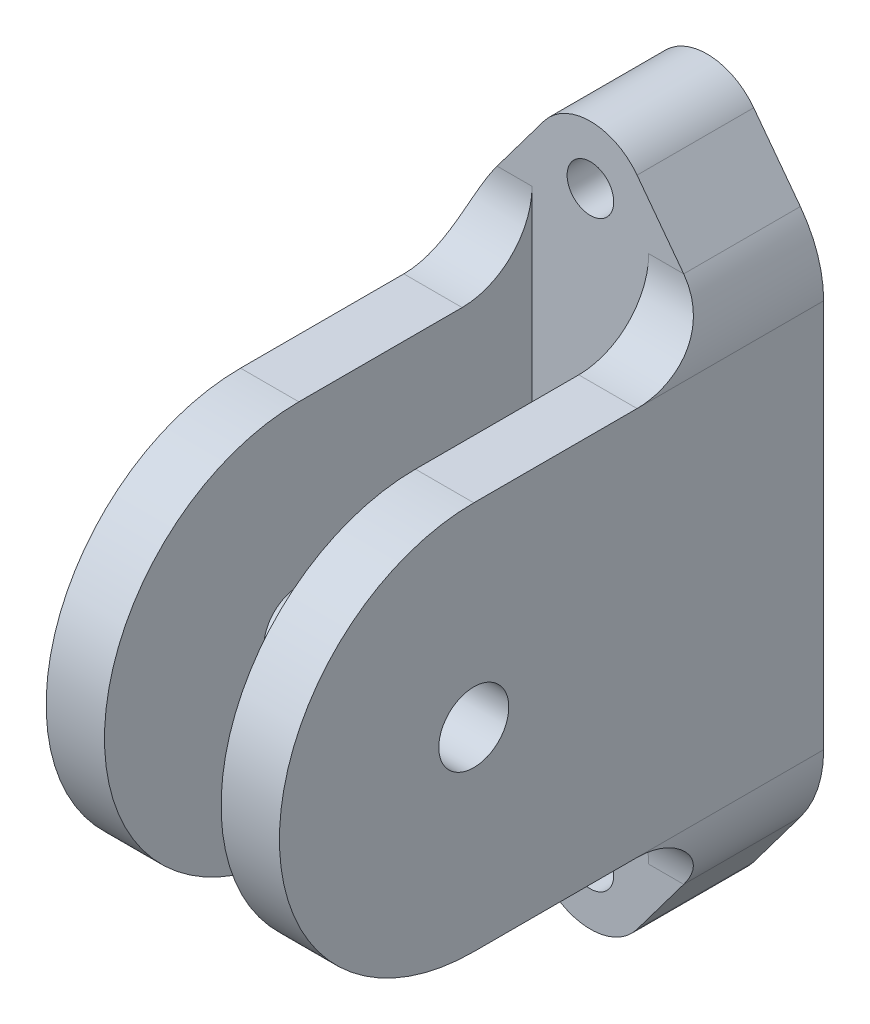
ISO-10303-21;
HEADER;
FILE_DESCRIPTION(('STEP AP214'),'2;1');
FILE_NAME('part.step','',(''),(''),'','','');
FILE_SCHEMA(('AUTOMOTIVE_DESIGN { 1 0 10303 214 1 1 1 1 }'));
ENDSEC;
DATA;
#1=APPLICATION_CONTEXT('core data for automotive mechanical design processes');
#2=APPLICATION_PROTOCOL_DEFINITION('international standard','automotive_design',2000,#1);
#3=PRODUCT_CONTEXT('',#1,'mechanical');
#4=PRODUCT('Part','Part','',(#3));
#5=PRODUCT_RELATED_PRODUCT_CATEGORY('part','',(#4));
#6=PRODUCT_DEFINITION_FORMATION('','',#4);
#7=PRODUCT_DEFINITION_CONTEXT('part definition',#1,'design');
#8=PRODUCT_DEFINITION('design','',#6,#7);
#9=PRODUCT_DEFINITION_SHAPE('','',#8);
#10=(LENGTH_UNIT() NAMED_UNIT(*) SI_UNIT(.MILLI.,.METRE.));
#11=(NAMED_UNIT(*) PLANE_ANGLE_UNIT() SI_UNIT($,.RADIAN.));
#12=(NAMED_UNIT(*) SI_UNIT($,.STERADIAN.) SOLID_ANGLE_UNIT());
#13=UNCERTAINTY_MEASURE_WITH_UNIT(LENGTH_MEASURE(1.E-05),#10,'distance_accuracy_value','');
#14=(GEOMETRIC_REPRESENTATION_CONTEXT(3) GLOBAL_UNCERTAINTY_ASSIGNED_CONTEXT((#13)) GLOBAL_UNIT_ASSIGNED_CONTEXT((#10,
#11,#12)) REPRESENTATION_CONTEXT('',''));
#15=CARTESIAN_POINT('',(0.,0.,0.));
#16=DIRECTION('',(0.,0.,1.));
#17=DIRECTION('',(1.,0.,0.));
#18=AXIS2_PLACEMENT_3D('',#15,#16,#17);
#19=CARTESIAN_POINT('',(0.,12.5,5.));
#20=DIRECTION('',(0.,0.,1.));
#21=DIRECTION('',(1.,0.,0.));
#22=AXIS2_PLACEMENT_3D('',#19,#20,#21);
#23=PLANE('',#22);
#24=CARTESIAN_POINT('',(0.,12.5,5.));
#25=DIRECTION('',(0.,0.,1.));
#26=DIRECTION('',(1.,0.,0.));
#27=AXIS2_PLACEMENT_3D('',#24,#25,#26);
#28=CIRCLE('',#27,1.);
#29=CARTESIAN_POINT('',(1.,12.5,5.));
#30=VERTEX_POINT('',#29);
#31=EDGE_CURVE('E256',#30,#30,#28,.T.);
#32=ORIENTED_EDGE('',*,*,#31,.F.);
#33=EDGE_LOOP('',(#32));
#34=FACE_BOUND('',#33,.T.);
#35=CARTESIAN_POINT('',(0.,-12.5,5.));
#36=DIRECTION('',(0.,0.,1.));
#37=DIRECTION('',(1.,0.,0.));
#38=AXIS2_PLACEMENT_3D('',#35,#36,#37);
#39=CIRCLE('',#38,1.);
#40=CARTESIAN_POINT('',(1.,-12.5,5.));
#41=VERTEX_POINT('',#40);
#42=EDGE_CURVE('E250',#41,#41,#39,.T.);
#43=ORIENTED_EDGE('',*,*,#42,.F.);
#44=EDGE_LOOP('',(#43));
#45=FACE_BOUND('',#44,.T.);
#46=DIRECTION('',(0.,-1.,0.));
#47=VECTOR('',#46,1.);
#48=CARTESIAN_POINT('',(2.5,8.33333333333333,5.));
#49=LINE('',#48,#47);
#50=CARTESIAN_POINT('',(2.5,11.3333333333333,5.));
#51=VERTEX_POINT('',#50);
#52=CARTESIAN_POINT('',(2.5,-11.3333333333333,5.));
#53=VERTEX_POINT('',#52);
#54=EDGE_CURVE('E207',#51,#53,#49,.T.);
#55=ORIENTED_EDGE('',*,*,#54,.F.);
#56=DIRECTION('',(1.,0.,0.));
#57=VECTOR('',#56,1.);
#58=CARTESIAN_POINT('',(0.,11.3333333333333,5.));
#59=LINE('',#58,#57);
#60=CARTESIAN_POINT('',(4.,11.3333333333333,5.));
#61=VERTEX_POINT('',#60);
#62=EDGE_CURVE('E340',#51,#61,#59,.T.);
#63=ORIENTED_EDGE('',*,*,#62,.T.);
#64=DIRECTION('',(-0.6,0.8,0.));
#65=VECTOR('',#64,1.);
#66=CARTESIAN_POINT('',(4.00000000000001,11.3333333333333,5.));
#67=LINE('',#66,#65);
#68=CARTESIAN_POINT('',(2.,14.,5.));
#69=VERTEX_POINT('',#68);
#70=EDGE_CURVE('E276',#61,#69,#67,.T.);
#71=ORIENTED_EDGE('',*,*,#70,.T.);
#72=CARTESIAN_POINT('',(0.,12.5,5.));
#73=DIRECTION('',(0.,0.,1.));
#74=DIRECTION('',(1.,0.,0.));
#75=AXIS2_PLACEMENT_3D('',#72,#73,#74);
#76=CIRCLE('',#75,2.5);
#77=CARTESIAN_POINT('',(-2.,14.,5.));
#78=VERTEX_POINT('',#77);
#79=EDGE_CURVE('E262',#69,#78,#76,.T.);
#80=ORIENTED_EDGE('',*,*,#79,.T.);
#81=DIRECTION('',(-0.6,-0.8,0.));
#82=VECTOR('',#81,1.);
#83=CARTESIAN_POINT('',(-4.00000000000001,11.3333333333333,5.));
#84=LINE('',#83,#82);
#85=CARTESIAN_POINT('',(-4.00000000000001,11.3333333333333,5.));
#86=VERTEX_POINT('',#85);
#87=EDGE_CURVE('E265',#78,#86,#84,.T.);
#88=ORIENTED_EDGE('',*,*,#87,.T.);
#89=DIRECTION('',(-1.,0.,0.));
#90=VECTOR('',#89,1.);
#91=CARTESIAN_POINT('',(-2.5,11.3333333333333,5.));
#92=LINE('',#91,#90);
#93=CARTESIAN_POINT('',(-2.5,11.3333333333333,5.));
#94=VERTEX_POINT('',#93);
#95=EDGE_CURVE('E334',#86,#94,#92,.F.);
#96=ORIENTED_EDGE('',*,*,#95,.T.);
#97=DIRECTION('',(0.,-1.,0.));
#98=VECTOR('',#97,1.);
#99=CARTESIAN_POINT('',(-2.5,8.33333333333333,5.));
#100=LINE('',#99,#98);
#101=CARTESIAN_POINT('',(-2.5,-11.3333333333333,5.));
#102=VERTEX_POINT('',#101);
#103=EDGE_CURVE('E227',#94,#102,#100,.T.);
#104=ORIENTED_EDGE('',*,*,#103,.T.);
#105=DIRECTION('',(-1.,0.,0.));
#106=VECTOR('',#105,1.);
#107=CARTESIAN_POINT('',(-5.,-11.3333333333333,5.));
#108=LINE('',#107,#106);
#109=CARTESIAN_POINT('',(-4.,-11.3333333333333,5.));
#110=VERTEX_POINT('',#109);
#111=EDGE_CURVE('E331',#102,#110,#108,.T.);
#112=ORIENTED_EDGE('',*,*,#111,.T.);
#113=DIRECTION('',(0.6,-0.8,0.));
#114=VECTOR('',#113,1.);
#115=CARTESIAN_POINT('',(-4.00000000000001,-11.3333333333333,5.));
#116=LINE('',#115,#114);
#117=CARTESIAN_POINT('',(-2.,-14.,5.));
#118=VERTEX_POINT('',#117);
#119=EDGE_CURVE('E269',#110,#118,#116,.T.);
#120=ORIENTED_EDGE('',*,*,#119,.T.);
#121=CARTESIAN_POINT('',(0.,-12.5,5.));
#122=DIRECTION('',(0.,0.,1.));
#123=DIRECTION('',(-1.,0.,0.));
#124=AXIS2_PLACEMENT_3D('',#121,#122,#123);
#125=CIRCLE('',#124,2.5);
#126=CARTESIAN_POINT('',(2.,-14.,5.));
#127=VERTEX_POINT('',#126);
#128=EDGE_CURVE('E271',#118,#127,#125,.T.);
#129=ORIENTED_EDGE('',*,*,#128,.T.);
#130=DIRECTION('',(0.6,0.8,0.));
#131=VECTOR('',#130,1.);
#132=CARTESIAN_POINT('',(4.00000000000001,-11.3333333333333,5.));
#133=LINE('',#132,#131);
#134=CARTESIAN_POINT('',(4.00000000000001,-11.3333333333333,5.));
#135=VERTEX_POINT('',#134);
#136=EDGE_CURVE('E273',#127,#135,#133,.T.);
#137=ORIENTED_EDGE('',*,*,#136,.T.);
#138=DIRECTION('',(1.,0.,0.));
#139=VECTOR('',#138,1.);
#140=CARTESIAN_POINT('',(0.,-11.3333333333333,5.));
#141=LINE('',#140,#139);
#142=EDGE_CURVE('E337',#135,#53,#141,.F.);
#143=ORIENTED_EDGE('',*,*,#142,.T.);
#144=EDGE_LOOP('',(#55,#63,#71,#80,#88,#96,#104,#112,#120,#129,#137,#143));
#145=FACE_BOUND('',#144,.T.);
#146=ADVANCED_FACE('F37',(#34,#45,#145),#23,.T.);
#147=CARTESIAN_POINT('',(0.,12.5,0.));
#148=DIRECTION('',(0.,0.,1.));
#149=DIRECTION('',(1.,0.,0.));
#150=AXIS2_PLACEMENT_3D('',#147,#148,#149);
#151=PLANE('',#150);
#152=CARTESIAN_POINT('',(0.,12.5,0.));
#153=DIRECTION('',(0.,0.,1.));
#154=DIRECTION('',(1.,0.,0.));
#155=AXIS2_PLACEMENT_3D('',#152,#153,#154);
#156=CIRCLE('',#155,2.5);
#157=CARTESIAN_POINT('',(2.,14.,0.));
#158=VERTEX_POINT('',#157);
#159=CARTESIAN_POINT('',(-2.,14.,0.));
#160=VERTEX_POINT('',#159);
#161=EDGE_CURVE('E259',#158,#160,#156,.T.);
#162=ORIENTED_EDGE('',*,*,#161,.F.);
#163=DIRECTION('',(-0.6,0.8,0.));
#164=VECTOR('',#163,1.);
#165=CARTESIAN_POINT('',(4.00000000000001,11.3333333333333,0.));
#166=LINE('',#165,#164);
#167=CARTESIAN_POINT('',(4.,11.3333333333333,0.));
#168=VERTEX_POINT('',#167);
#169=EDGE_CURVE('E266',#168,#158,#166,.T.);
#170=ORIENTED_EDGE('',*,*,#169,.F.);
#171=CARTESIAN_POINT('',(0.,8.33333333333333,0.));
#172=DIRECTION('',(0.,0.,1.));
#173=DIRECTION('',(-1.,0.,0.));
#174=AXIS2_PLACEMENT_3D('',#171,#172,#173);
#175=CIRCLE('',#174,5.);
#176=CARTESIAN_POINT('',(5.,8.33333333333333,0.));
#177=VERTEX_POINT('',#176);
#178=EDGE_CURVE('E299',#177,#168,#175,.T.);
#179=ORIENTED_EDGE('',*,*,#178,.F.);
#180=DIRECTION('',(0.,1.,0.));
#181=VECTOR('',#180,1.);
#182=CARTESIAN_POINT('',(5.,8.33333333333333,0.));
#183=LINE('',#182,#181);
#184=CARTESIAN_POINT('',(5.,-8.33333333333333,0.));
#185=VERTEX_POINT('',#184);
#186=EDGE_CURVE('E297',#185,#177,#183,.T.);
#187=ORIENTED_EDGE('',*,*,#186,.F.);
#188=CARTESIAN_POINT('',(0.,-8.33333333333333,0.));
#189=DIRECTION('',(0.,0.,1.));
#190=DIRECTION('',(1.,0.,0.));
#191=AXIS2_PLACEMENT_3D('',#188,#189,#190);
#192=CIRCLE('',#191,5.);
#193=CARTESIAN_POINT('',(4.00000000000001,-11.3333333333333,0.));
#194=VERTEX_POINT('',#193);
#195=EDGE_CURVE('E295',#194,#185,#192,.T.);
#196=ORIENTED_EDGE('',*,*,#195,.F.);
#197=DIRECTION('',(0.6,0.8,0.));
#198=VECTOR('',#197,1.);
#199=CARTESIAN_POINT('',(4.00000000000001,-11.3333333333333,0.));
#200=LINE('',#199,#198);
#201=CARTESIAN_POINT('',(2.,-14.,0.));
#202=VERTEX_POINT('',#201);
#203=EDGE_CURVE('E293',#202,#194,#200,.T.);
#204=ORIENTED_EDGE('',*,*,#203,.F.);
#205=CARTESIAN_POINT('',(0.,-12.5,0.));
#206=DIRECTION('',(0.,0.,1.));
#207=DIRECTION('',(-1.,0.,0.));
#208=AXIS2_PLACEMENT_3D('',#205,#206,#207);
#209=CIRCLE('',#208,2.5);
#210=CARTESIAN_POINT('',(-2.,-14.,0.));
#211=VERTEX_POINT('',#210);
#212=EDGE_CURVE('E291',#211,#202,#209,.T.);
#213=ORIENTED_EDGE('',*,*,#212,.F.);
#214=DIRECTION('',(0.6,-0.8,0.));
#215=VECTOR('',#214,1.);
#216=CARTESIAN_POINT('',(-4.00000000000001,-11.3333333333333,0.));
#217=LINE('',#216,#215);
#218=CARTESIAN_POINT('',(-4.,-11.3333333333333,0.));
#219=VERTEX_POINT('',#218);
#220=EDGE_CURVE('E289',#219,#211,#217,.T.);
#221=ORIENTED_EDGE('',*,*,#220,.F.);
#222=CARTESIAN_POINT('',(0.,-8.33333333333333,0.));
#223=DIRECTION('',(0.,0.,1.));
#224=DIRECTION('',(1.,0.,0.));
#225=AXIS2_PLACEMENT_3D('',#222,#223,#224);
#226=CIRCLE('',#225,5.);
#227=CARTESIAN_POINT('',(-5.,-8.33333333333333,0.));
#228=VERTEX_POINT('',#227);
#229=EDGE_CURVE('E287',#228,#219,#226,.T.);
#230=ORIENTED_EDGE('',*,*,#229,.F.);
#231=DIRECTION('',(0.,-1.,0.));
#232=VECTOR('',#231,1.);
#233=CARTESIAN_POINT('',(-5.,8.33333333333333,0.));
#234=LINE('',#233,#232);
#235=CARTESIAN_POINT('',(-5.,8.33333333333333,0.));
#236=VERTEX_POINT('',#235);
#237=EDGE_CURVE('E285',#236,#228,#234,.T.);
#238=ORIENTED_EDGE('',*,*,#237,.F.);
#239=CARTESIAN_POINT('',(0.,8.33333333333333,0.));
#240=DIRECTION('',(0.,0.,1.));
#241=DIRECTION('',(1.,0.,0.));
#242=AXIS2_PLACEMENT_3D('',#239,#240,#241);
#243=CIRCLE('',#242,5.);
#244=CARTESIAN_POINT('',(-4.00000000000001,11.3333333333333,0.));
#245=VERTEX_POINT('',#244);
#246=EDGE_CURVE('E283',#245,#236,#243,.T.);
#247=ORIENTED_EDGE('',*,*,#246,.F.);
#248=DIRECTION('',(-0.6,-0.8,0.));
#249=VECTOR('',#248,1.);
#250=CARTESIAN_POINT('',(-4.00000000000001,11.3333333333333,0.));
#251=LINE('',#250,#249);
#252=EDGE_CURVE('E281',#160,#245,#251,.T.);
#253=ORIENTED_EDGE('',*,*,#252,.F.);
#254=EDGE_LOOP('',(#162,#170,#179,#187,#196,#204,#213,#221,#230,#238,#247,#253));
#255=FACE_BOUND('',#254,.T.);
#256=CARTESIAN_POINT('',(0.,12.5,0.));
#257=DIRECTION('',(0.,0.,1.));
#258=DIRECTION('',(1.,0.,0.));
#259=AXIS2_PLACEMENT_3D('',#256,#257,#258);
#260=CIRCLE('',#259,1.);
#261=CARTESIAN_POINT('',(1.,12.5,0.));
#262=VERTEX_POINT('',#261);
#263=EDGE_CURVE('E253',#262,#262,#260,.T.);
#264=ORIENTED_EDGE('',*,*,#263,.T.);
#265=EDGE_LOOP('',(#264));
#266=FACE_BOUND('',#265,.T.);
#267=CARTESIAN_POINT('',(0.,-12.5,0.));
#268=DIRECTION('',(0.,0.,1.));
#269=DIRECTION('',(1.,0.,0.));
#270=AXIS2_PLACEMENT_3D('',#267,#268,#269);
#271=CIRCLE('',#270,1.);
#272=CARTESIAN_POINT('',(1.,-12.5,0.));
#273=VERTEX_POINT('',#272);
#274=EDGE_CURVE('E247',#273,#273,#271,.T.);
#275=ORIENTED_EDGE('',*,*,#274,.T.);
#276=EDGE_LOOP('',(#275));
#277=FACE_BOUND('',#276,.T.);
#278=ADVANCED_FACE('F436',(#255,#266,#277),#151,.F.);
#279=CARTESIAN_POINT('',(0.,12.5,5.));
#280=DIRECTION('',(0.,0.,-1.));
#281=DIRECTION('',(-1.,0.,0.));
#282=AXIS2_PLACEMENT_3D('',#279,#280,#281);
#283=CYLINDRICAL_SURFACE('',#282,2.5);
#284=ORIENTED_EDGE('',*,*,#161,.T.);
#285=DIRECTION('',(0.,0.,-1.));
#286=VECTOR('',#285,1.);
#287=CARTESIAN_POINT('',(-2.,14.,5.));
#288=LINE('',#287,#286);
#289=EDGE_CURVE('E328',#78,#160,#288,.T.);
#290=ORIENTED_EDGE('',*,*,#289,.F.);
#291=ORIENTED_EDGE('',*,*,#79,.F.);
#292=DIRECTION('',(0.,0.,-1.));
#293=VECTOR('',#292,1.);
#294=CARTESIAN_POINT('',(2.,14.,5.));
#295=LINE('',#294,#293);
#296=EDGE_CURVE('E278',#69,#158,#295,.T.);
#297=ORIENTED_EDGE('',*,*,#296,.T.);
#298=EDGE_LOOP('',(#284,#290,#291,#297));
#299=FACE_BOUND('',#298,.T.);
#300=ADVANCED_FACE('F375',(#299),#283,.T.);
#301=CARTESIAN_POINT('',(-4.00000000000001,11.3333333333333,5.));
#302=DIRECTION('',(0.8,-0.6,0.));
#303=DIRECTION('',(0.6,0.8,0.));
#304=AXIS2_PLACEMENT_3D('',#301,#302,#303);
#305=PLANE('',#304);
#306=ORIENTED_EDGE('',*,*,#252,.T.);
#307=DIRECTION('',(0.,0.,-1.));
#308=VECTOR('',#307,1.);
#309=CARTESIAN_POINT('',(-4.00000000000001,11.3333333333333,5.));
#310=LINE('',#309,#308);
#311=EDGE_CURVE('E325',#86,#245,#310,.T.);
#312=ORIENTED_EDGE('',*,*,#311,.F.);
#313=ORIENTED_EDGE('',*,*,#87,.F.);
#314=ORIENTED_EDGE('',*,*,#289,.T.);
#315=EDGE_LOOP('',(#306,#312,#313,#314));
#316=FACE_BOUND('',#315,.T.);
#317=ADVANCED_FACE('F430',(#316),#305,.F.);
#318=CARTESIAN_POINT('',(0.,8.33333333333333,5.));
#319=DIRECTION('',(0.,0.,-1.));
#320=DIRECTION('',(-1.,0.,0.));
#321=AXIS2_PLACEMENT_3D('',#318,#319,#320);
#322=CYLINDRICAL_SURFACE('',#321,5.);
#323=ORIENTED_EDGE('',*,*,#246,.T.);
#324=DIRECTION('',(0.,0.,-1.));
#325=VECTOR('',#324,1.);
#326=CARTESIAN_POINT('',(-5.,8.33333333333333,5.));
#327=LINE('',#326,#325);
#328=CARTESIAN_POINT('',(-5.,8.33333333333333,8.));
#329=VERTEX_POINT('',#328);
#330=EDGE_CURVE('E79',#329,#236,#327,.T.);
#331=ORIENTED_EDGE('',*,*,#330,.F.);
#332=CARTESIAN_POINT('',(-5.,8.33333333333333,8.));
#333=CARTESIAN_POINT('',(-4.99998432087416,8.33332539716243,7.91592201008272));
#334=CARTESIAN_POINT('',(-4.99999959426291,8.33686787290173,7.83184787163631));
#335=CARTESIAN_POINT('',(-4.99997794837404,8.35099217143,7.6642956274513));
#336=CARTESIAN_POINT('',(-4.9999410308143,8.36157376251791,7.58081750218561));
#337=CARTESIAN_POINT('',(-4.9997009304649,8.38971351660552,7.41504769532934));
#338=CARTESIAN_POINT('',(-4.99949776310699,8.40727103200373,7.33275590434152));
#339=CARTESIAN_POINT('',(-4.99870040912838,8.44922005601693,7.16995997263874));
#340=CARTESIAN_POINT('',(-4.99810622740678,8.47361147900628,7.08945580953928));
#341=CARTESIAN_POINT('',(-4.99531547315222,8.55685079835486,6.85136830989069));
#342=CARTESIAN_POINT('',(-4.99211086104045,8.62576960306649,6.69717563439474));
#343=CARTESIAN_POINT('',(-4.97991835692078,8.78831481263635,6.40275890279938));
#344=CARTESIAN_POINT('',(-4.97093141790985,8.88193714455677,6.26253254927933));
#345=CARTESIAN_POINT('',(-4.94361115961146,9.08927875899239,6.00212959100237));
#346=CARTESIAN_POINT('',(-4.92541647903817,9.20268403763815,5.8816897091521));
#347=CARTESIAN_POINT('',(-4.87618260349126,9.44606628087398,5.66226402508433));
#348=CARTESIAN_POINT('',(-4.84515880506401,9.57602325242711,5.56325272213818));
#349=CARTESIAN_POINT('',(-4.76974223696532,9.83905086711624,5.39420547396049));
#350=CARTESIAN_POINT('',(-4.72621909885985,9.97151456943906,5.32283252356247));
#351=CARTESIAN_POINT('',(-4.62405276014827,10.2409123826257,5.20206862719214));
#352=CARTESIAN_POINT('',(-4.56538462684671,10.3778535367869,5.15271429877156));
#353=CARTESIAN_POINT('',(-4.4651719780308,10.5846550858522,5.09398845572815));
#354=CARTESIAN_POINT('',(-4.42899377872861,10.6550503436675,5.07680947411081));
#355=CARTESIAN_POINT('',(-4.35280698148083,10.7949180487631,5.04784838224127));
#356=CARTESIAN_POINT('',(-4.3127973034467,10.8643902295069,5.0360677992366));
#357=CARTESIAN_POINT('',(-4.22924604899356,11.001650956887,5.01758888360106));
#358=CARTESIAN_POINT('',(-4.18571195678319,11.0694426916221,5.01088007881984));
#359=CARTESIAN_POINT('',(-4.09530622473625,11.2030011590927,5.00208489712827));
#360=CARTESIAN_POINT('',(-4.0484371667074,11.2687694030346,4.99999498377788));
#361=CARTESIAN_POINT('',(-4.,11.3333333333333,5.));
#362=B_SPLINE_CURVE_WITH_KNOTS('',3,(#332,#333,#334,#335,#336,#337,#338,#339,#340,#341,#342,
#343,#344,#345,#346,#347,#348,#349,#350,#351,#352,#353,#354,#355,#356,#357,#358,#359,#360,#361),
.UNSPECIFIED.,.F.,.F.,(4,2,2,2,2,2,2,2,2,2,2,2,2,2,4),(0.,0.252152395340697,0.504296491188439,
0.756417185011556,1.00853472002273,1.51266662875888,2.01671547177342,2.51339125339692,
3.00947268394061,3.47707796659586,3.94545801659758,4.18819907961929,4.43100877357948,
4.6733157371132,4.91543711469924),.UNSPECIFIED.);
#363=EDGE_CURVE('E422',#329,#86,#362,.T.);
#364=ORIENTED_EDGE('',*,*,#363,.T.);
#365=ORIENTED_EDGE('',*,*,#311,.T.);
#366=EDGE_LOOP('',(#323,#331,#364,#365));
#367=FACE_BOUND('',#366,.T.);
#368=ADVANCED_FACE('F427',(#367),#322,.T.);
#369=CARTESIAN_POINT('',(-5.,8.33333333333333,5.));
#370=DIRECTION('',(1.,0.,0.));
#371=DIRECTION('',(0.,0.,-1.));
#372=AXIS2_PLACEMENT_3D('',#369,#370,#371);
#373=PLANE('',#372);
#374=ORIENTED_EDGE('',*,*,#237,.T.);
#375=DIRECTION('',(0.,0.,-1.));
#376=VECTOR('',#375,1.);
#377=CARTESIAN_POINT('',(-5.,-8.33333333333333,5.));
#378=LINE('',#377,#376);
#379=CARTESIAN_POINT('',(-5.,-8.33333333333333,8.));
#380=VERTEX_POINT('',#379);
#381=EDGE_CURVE('E53',#380,#228,#378,.T.);
#382=ORIENTED_EDGE('',*,*,#381,.F.);
#383=DIRECTION('',(0.,0.,1.));
#384=VECTOR('',#383,1.);
#385=CARTESIAN_POINT('',(-5.,-8.33333333333333,15.));
#386=LINE('',#385,#384);
#387=CARTESIAN_POINT('',(-5.,-8.33333333333333,15.));
#388=VERTEX_POINT('',#387);
#389=EDGE_CURVE('E224',#380,#388,#386,.T.);
#390=ORIENTED_EDGE('',*,*,#389,.T.);
#391=CARTESIAN_POINT('',(-5.,0.,15.));
#392=DIRECTION('',(-1.,0.,0.));
#393=DIRECTION('',(0.,0.,-1.));
#394=AXIS2_PLACEMENT_3D('',#391,#392,#393);
#395=CIRCLE('',#394,8.33333333333333);
#396=CARTESIAN_POINT('',(-5.,8.33333333333333,15.));
#397=VERTEX_POINT('',#396);
#398=EDGE_CURVE('E240',#388,#397,#395,.T.);
#399=ORIENTED_EDGE('',*,*,#398,.T.);
#400=DIRECTION('',(0.,0.,-1.));
#401=VECTOR('',#400,1.);
#402=CARTESIAN_POINT('',(-5.,8.33333333333333,5.));
#403=LINE('',#402,#401);
#404=EDGE_CURVE('E230',#397,#329,#403,.T.);
#405=ORIENTED_EDGE('',*,*,#404,.T.);
#406=ORIENTED_EDGE('',*,*,#330,.T.);
#407=EDGE_LOOP('',(#374,#382,#390,#399,#405,#406));
#408=FACE_BOUND('',#407,.T.);
#409=CARTESIAN_POINT('',(-5.,0.,15.));
#410=DIRECTION('',(-1.,0.,0.));
#411=DIRECTION('',(0.,0.,1.));
#412=AXIS2_PLACEMENT_3D('',#409,#410,#411);
#413=CIRCLE('',#412,1.5);
#414=CARTESIAN_POINT('',(-5.,0.,16.5));
#415=VERTEX_POINT('',#414);
#416=EDGE_CURVE('E219',#415,#415,#413,.T.);
#417=ORIENTED_EDGE('',*,*,#416,.F.);
#418=EDGE_LOOP('',(#417));
#419=FACE_BOUND('',#418,.T.);
#420=ADVANCED_FACE('F412',(#408,#419),#373,.F.);
#421=CARTESIAN_POINT('',(0.,-8.33333333333333,5.));
#422=DIRECTION('',(0.,0.,-1.));
#423=DIRECTION('',(-1.,0.,0.));
#424=AXIS2_PLACEMENT_3D('',#421,#422,#423);
#425=CYLINDRICAL_SURFACE('',#424,5.);
#426=ORIENTED_EDGE('',*,*,#229,.T.);
#427=DIRECTION('',(0.,0.,-1.));
#428=VECTOR('',#427,1.);
#429=CARTESIAN_POINT('',(-4.,-11.3333333333333,5.));
#430=LINE('',#429,#428);
#431=EDGE_CURVE('E320',#110,#219,#430,.T.);
#432=ORIENTED_EDGE('',*,*,#431,.F.);
#433=CARTESIAN_POINT('',(-4.00000000000001,-11.3333333333333,5.));
#434=CARTESIAN_POINT('',(-4.04985766476093,-11.266879331875,4.99999313441499));
#435=CARTESIAN_POINT('',(-4.09805409848132,-11.1991442861476,5.00220837679827));
#436=CARTESIAN_POINT('',(-4.19090936305462,-11.0615446078447,5.01154220862604));
#437=CARTESIAN_POINT('',(-4.23556534312243,-10.9916783206224,5.018664705581));
#438=CARTESIAN_POINT('',(-4.3211497134896,-10.8501818226173,5.03829783584707));
#439=CARTESIAN_POINT('',(-4.36206863467248,-10.7785476849542,5.05082172020304));
#440=CARTESIAN_POINT('',(-4.43983167298902,-10.6343333654318,5.08163862236578));
#441=CARTESIAN_POINT('',(-4.47667690535526,-10.5617534486063,5.09993005591229));
#442=CARTESIAN_POINT('',(-4.54634319463125,-10.4159581568636,5.14268938023906));
#443=CARTESIAN_POINT('',(-4.57914148003864,-10.3427414657845,5.16719004527735));
#444=CARTESIAN_POINT('',(-4.64041485567188,-10.1968802707638,5.22249090265195));
#445=CARTESIAN_POINT('',(-4.6688901849783,-10.1242357353899,5.25329074639164));
#446=CARTESIAN_POINT('',(-4.72150653089405,-9.9805189958708,5.32115792084169));
#447=CARTESIAN_POINT('',(-4.74565638848833,-9.90944385099764,5.35821215957271));
#448=CARTESIAN_POINT('',(-4.78984492100031,-9.7695665505549,5.43852828111228));
#449=CARTESIAN_POINT('',(-4.80988393902967,-9.70076420568829,5.48178964532983));
#450=CARTESIAN_POINT('',(-4.84464865612345,-9.57167139748793,5.57056048504503));
#451=CARTESIAN_POINT('',(-4.85967269225056,-9.5111421699633,5.61560654947113));
#452=CARTESIAN_POINT('',(-4.88674084775185,-9.39325171674,5.7104974806264));
#453=CARTESIAN_POINT('',(-4.89878392082207,-9.33589160885926,5.76034402379779));
#454=CARTESIAN_POINT('',(-4.93090965484638,-9.16933463476097,5.91667751564234));
#455=CARTESIAN_POINT('',(-4.94699797143474,-9.06562530022426,6.02998284563886));
#456=CARTESIAN_POINT('',(-4.97150864354446,-8.875101799242,6.27332914923419));
#457=CARTESIAN_POINT('',(-4.9798139183491,-8.78856064423668,6.40359315712424));
#458=CARTESIAN_POINT('',(-4.9913739793349,-8.63666513154217,6.67625318796745));
#459=CARTESIAN_POINT('',(-4.99462728347672,-8.57131699545493,6.81865275807419));
#460=CARTESIAN_POINT('',(-4.99772527862961,-8.48710538651066,7.04776122364982));
#461=CARTESIAN_POINT('',(-4.9984377865343,-8.46039889077895,7.13166946941105));
#462=CARTESIAN_POINT('',(-4.99939501766316,-8.41444852365328,7.30154089981513));
#463=CARTESIAN_POINT('',(-4.99963967852219,-8.39520564745014,7.38750435687634));
#464=CARTESIAN_POINT('',(-4.99992901386871,-8.36433725668127,7.560883137302));
#465=CARTESIAN_POINT('',(-4.99997346249486,-8.3527203576619,7.64829998877605));
#466=CARTESIAN_POINT('',(-4.99999947043825,-8.3372137487651,7.82380996462812));
#467=CARTESIAN_POINT('',(-4.99998103419131,-8.33332349389086,7.91190304086877));
#468=CARTESIAN_POINT('',(-5.,-8.33333333333333,8.));
#469=B_SPLINE_CURVE_WITH_KNOTS('',3,(#433,#434,#435,#436,#437,#438,#439,#440,#441,#442,#443,
#444,#445,#446,#447,#448,#449,#450,#451,#452,#453,#454,#455,#456,#457,#458,#459,#460,#461,#462,
#463,#464,#465,#466,#467,#468),.UNSPECIFIED.,.F.,.F.,(4,2,2,2,2,2,2,2,2,2,2,2,2,2,2,2,2,4),(0.,
0.249219239669056,0.498637155391964,0.748670471806947,0.998635167519705,1.24994778155051,
1.5012464916999,1.75202555160378,2.00278367168317,2.23329884006649,2.46389480381952,
2.92495531758411,3.39284521820307,3.86087235246317,4.12475634115922,4.38867550376927,
4.6528923216538,4.91709050241236),.UNSPECIFIED.);
#470=EDGE_CURVE('E46',#110,#380,#469,.T.);
#471=ORIENTED_EDGE('',*,*,#470,.T.);
#472=ORIENTED_EDGE('',*,*,#381,.T.);
#473=EDGE_LOOP('',(#426,#432,#471,#472));
#474=FACE_BOUND('',#473,.T.);
#475=ADVANCED_FACE('F407',(#474),#425,.T.);
#476=CARTESIAN_POINT('',(-4.00000000000001,-11.3333333333333,5.));
#477=DIRECTION('',(0.8,0.6,0.));
#478=DIRECTION('',(-0.6,0.8,0.));
#479=AXIS2_PLACEMENT_3D('',#476,#477,#478);
#480=PLANE('',#479);
#481=ORIENTED_EDGE('',*,*,#220,.T.);
#482=DIRECTION('',(0.,0.,-1.));
#483=VECTOR('',#482,1.);
#484=CARTESIAN_POINT('',(-2.,-14.,5.));
#485=LINE('',#484,#483);
#486=EDGE_CURVE('E317',#118,#211,#485,.T.);
#487=ORIENTED_EDGE('',*,*,#486,.F.);
#488=ORIENTED_EDGE('',*,*,#119,.F.);
#489=ORIENTED_EDGE('',*,*,#431,.T.);
#490=EDGE_LOOP('',(#481,#487,#488,#489));
#491=FACE_BOUND('',#490,.T.);
#492=ADVANCED_FACE('F403',(#491),#480,.F.);
#493=CARTESIAN_POINT('',(0.,-12.5,5.));
#494=DIRECTION('',(0.,0.,-1.));
#495=DIRECTION('',(-1.,0.,0.));
#496=AXIS2_PLACEMENT_3D('',#493,#494,#495);
#497=CYLINDRICAL_SURFACE('',#496,2.5);
#498=ORIENTED_EDGE('',*,*,#212,.T.);
#499=DIRECTION('',(0.,0.,-1.));
#500=VECTOR('',#499,1.);
#501=CARTESIAN_POINT('',(2.,-14.,5.));
#502=LINE('',#501,#500);
#503=EDGE_CURVE('E314',#127,#202,#502,.T.);
#504=ORIENTED_EDGE('',*,*,#503,.F.);
#505=ORIENTED_EDGE('',*,*,#128,.F.);
#506=ORIENTED_EDGE('',*,*,#486,.T.);
#507=EDGE_LOOP('',(#498,#504,#505,#506));
#508=FACE_BOUND('',#507,.T.);
#509=ADVANCED_FACE('F399',(#508),#497,.T.);
#510=CARTESIAN_POINT('',(4.00000000000001,-11.3333333333333,5.));
#511=DIRECTION('',(-0.8,0.6,0.));
#512=DIRECTION('',(-0.6,-0.8,0.));
#513=AXIS2_PLACEMENT_3D('',#510,#511,#512);
#514=PLANE('',#513);
#515=ORIENTED_EDGE('',*,*,#203,.T.);
#516=DIRECTION('',(0.,0.,-1.));
#517=VECTOR('',#516,1.);
#518=CARTESIAN_POINT('',(4.00000000000001,-11.3333333333333,5.));
#519=LINE('',#518,#517);
#520=EDGE_CURVE('E311',#135,#194,#519,.T.);
#521=ORIENTED_EDGE('',*,*,#520,.F.);
#522=ORIENTED_EDGE('',*,*,#136,.F.);
#523=ORIENTED_EDGE('',*,*,#503,.T.);
#524=EDGE_LOOP('',(#515,#521,#522,#523));
#525=FACE_BOUND('',#524,.T.);
#526=ADVANCED_FACE('F395',(#525),#514,.F.);
#527=CARTESIAN_POINT('',(0.,-8.33333333333333,5.));
#528=DIRECTION('',(0.,0.,-1.));
#529=DIRECTION('',(-1.,0.,0.));
#530=AXIS2_PLACEMENT_3D('',#527,#528,#529);
#531=CYLINDRICAL_SURFACE('',#530,5.);
#532=ORIENTED_EDGE('',*,*,#195,.T.);
#533=DIRECTION('',(0.,0.,-1.));
#534=VECTOR('',#533,1.);
#535=CARTESIAN_POINT('',(5.,-8.33333333333333,5.));
#536=LINE('',#535,#534);
#537=CARTESIAN_POINT('',(5.,-8.33333333333333,8.));
#538=VERTEX_POINT('',#537);
#539=EDGE_CURVE('E308',#538,#185,#536,.T.);
#540=ORIENTED_EDGE('',*,*,#539,.F.);
#541=CARTESIAN_POINT('',(5.,-8.33333333333333,8.));
#542=CARTESIAN_POINT('',(4.99998432087416,-8.33332539716243,7.91592201008272));
#543=CARTESIAN_POINT('',(4.99999959426291,-8.33686787290173,7.83184787163631));
#544=CARTESIAN_POINT('',(4.99997794837404,-8.35099217143,7.6642956274513));
#545=CARTESIAN_POINT('',(4.9999410308143,-8.36157376251791,7.58081750218561));
#546=CARTESIAN_POINT('',(4.9997009304649,-8.38971351660552,7.41504769532934));
#547=CARTESIAN_POINT('',(4.99949776310699,-8.40727103200373,7.33275590434152));
#548=CARTESIAN_POINT('',(4.99870040912838,-8.44922005601693,7.16995997263873));
#549=CARTESIAN_POINT('',(4.99810622740678,-8.47361147900628,7.08945580953928));
#550=CARTESIAN_POINT('',(4.99531547315222,-8.55685079835486,6.85136830989069));
#551=CARTESIAN_POINT('',(4.99211086104045,-8.62576960306649,6.69717563439474));
#552=CARTESIAN_POINT('',(4.97991835692078,-8.78831481263635,6.40275890279938));
#553=CARTESIAN_POINT('',(4.97093141790984,-8.88193714455677,6.26253254927933));
#554=CARTESIAN_POINT('',(4.94361115961146,-9.08927875899239,6.00212959100237));
#555=CARTESIAN_POINT('',(4.92541647903817,-9.20268403763816,5.88168970915211));
#556=CARTESIAN_POINT('',(4.87618260349126,-9.44606628087398,5.66226402508433));
#557=CARTESIAN_POINT('',(4.84515880506401,-9.57602325242712,5.56325272213818));
#558=CARTESIAN_POINT('',(4.76974223696532,-9.83905086711624,5.39420547396049));
#559=CARTESIAN_POINT('',(4.72621909885985,-9.97151456943906,5.32283252356247));
#560=CARTESIAN_POINT('',(4.62405276014826,-10.2409123826257,5.20206862719214));
#561=CARTESIAN_POINT('',(4.56538462684671,-10.3778535367869,5.15271429877156));
#562=CARTESIAN_POINT('',(4.4651719780308,-10.5846550858522,5.09398845572815));
#563=CARTESIAN_POINT('',(4.42899377872861,-10.6550503436675,5.07680947411081));
#564=CARTESIAN_POINT('',(4.35280698148083,-10.7949180487631,5.04784838224127));
#565=CARTESIAN_POINT('',(4.31279730344669,-10.8643902295069,5.0360677992366));
#566=CARTESIAN_POINT('',(4.22924604899356,-11.001650956887,5.01758888360106));
#567=CARTESIAN_POINT('',(4.18571195678319,-11.0694426916221,5.01088007881984));
#568=CARTESIAN_POINT('',(4.09530622473625,-11.2030011590927,5.00208489712827));
#569=CARTESIAN_POINT('',(4.0484371667074,-11.2687694030346,4.99999498377788));
#570=CARTESIAN_POINT('',(4.,-11.3333333333333,5.));
#571=B_SPLINE_CURVE_WITH_KNOTS('',3,(#541,#542,#543,#544,#545,#546,#547,#548,#549,#550,#551,
#552,#553,#554,#555,#556,#557,#558,#559,#560,#561,#562,#563,#564,#565,#566,#567,#568,#569,#570),
.UNSPECIFIED.,.F.,.F.,(4,2,2,2,2,2,2,2,2,2,2,2,2,2,4),(0.,0.252152395340697,0.504296491188439,
0.756417185011556,1.00853472002273,1.51266662875888,2.01671547177342,2.51339125339692,
3.00947268394061,3.47707796659586,3.94545801659758,4.18819907961929,4.43100877357948,
4.6733157371132,4.91543711469924),.UNSPECIFIED.);
#572=EDGE_CURVE('E382',#538,#135,#571,.T.);
#573=ORIENTED_EDGE('',*,*,#572,.T.);
#574=ORIENTED_EDGE('',*,*,#520,.T.);
#575=EDGE_LOOP('',(#532,#540,#573,#574));
#576=FACE_BOUND('',#575,.T.);
#577=ADVANCED_FACE('F390',(#576),#531,.T.);
#578=CARTESIAN_POINT('',(5.,8.33333333333333,5.));
#579=DIRECTION('',(-1.,0.,0.));
#580=DIRECTION('',(0.,0.,1.));
#581=AXIS2_PLACEMENT_3D('',#578,#579,#580);
#582=PLANE('',#581);
#583=ORIENTED_EDGE('',*,*,#186,.T.);
#584=DIRECTION('',(0.,0.,-1.));
#585=VECTOR('',#584,1.);
#586=CARTESIAN_POINT('',(5.,8.33333333333333,5.));
#587=LINE('',#586,#585);
#588=CARTESIAN_POINT('',(5.,8.33333333333333,8.));
#589=VERTEX_POINT('',#588);
#590=EDGE_CURVE('E62',#589,#177,#587,.T.);
#591=ORIENTED_EDGE('',*,*,#590,.F.);
#592=DIRECTION('',(0.,0.,-1.));
#593=VECTOR('',#592,1.);
#594=CARTESIAN_POINT('',(5.,8.33333333333333,5.));
#595=LINE('',#594,#593);
#596=CARTESIAN_POINT('',(5.,8.33333333333333,15.));
#597=VERTEX_POINT('',#596);
#598=EDGE_CURVE('E214',#597,#589,#595,.T.);
#599=ORIENTED_EDGE('',*,*,#598,.F.);
#600=CARTESIAN_POINT('',(5.,0.,15.));
#601=DIRECTION('',(-1.,0.,0.));
#602=DIRECTION('',(0.,0.,-1.));
#603=AXIS2_PLACEMENT_3D('',#600,#601,#602);
#604=CIRCLE('',#603,8.33333333333333);
#605=CARTESIAN_POINT('',(5.,-8.33333333333333,15.));
#606=VERTEX_POINT('',#605);
#607=EDGE_CURVE('E200',#606,#597,#604,.T.);
#608=ORIENTED_EDGE('',*,*,#607,.F.);
#609=DIRECTION('',(0.,0.,1.));
#610=VECTOR('',#609,1.);
#611=CARTESIAN_POINT('',(5.,-8.33333333333333,15.));
#612=LINE('',#611,#610);
#613=EDGE_CURVE('E209',#538,#606,#612,.T.);
#614=ORIENTED_EDGE('',*,*,#613,.F.);
#615=ORIENTED_EDGE('',*,*,#539,.T.);
#616=EDGE_LOOP('',(#583,#591,#599,#608,#614,#615));
#617=FACE_BOUND('',#616,.T.);
#618=CARTESIAN_POINT('',(5.,0.,15.));
#619=DIRECTION('',(-1.,0.,0.));
#620=DIRECTION('',(0.,0.,1.));
#621=AXIS2_PLACEMENT_3D('',#618,#619,#620);
#622=CIRCLE('',#621,1.5);
#623=CARTESIAN_POINT('',(5.,0.,16.5));
#624=VERTEX_POINT('',#623);
#625=EDGE_CURVE('E739',#624,#624,#622,.T.);
#626=ORIENTED_EDGE('',*,*,#625,.T.);
#627=EDGE_LOOP('',(#626));
#628=FACE_BOUND('',#627,.T.);
#629=ADVANCED_FACE('F394',(#617,#628),#582,.F.);
#630=CARTESIAN_POINT('',(0.,8.33333333333333,5.));
#631=DIRECTION('',(0.,0.,-1.));
#632=DIRECTION('',(-1.,0.,0.));
#633=AXIS2_PLACEMENT_3D('',#630,#631,#632);
#634=CYLINDRICAL_SURFACE('',#633,5.);
#635=ORIENTED_EDGE('',*,*,#178,.T.);
#636=DIRECTION('',(0.,0.,-1.));
#637=VECTOR('',#636,1.);
#638=CARTESIAN_POINT('',(4.,11.3333333333333,5.));
#639=LINE('',#638,#637);
#640=EDGE_CURVE('E304',#61,#168,#639,.T.);
#641=ORIENTED_EDGE('',*,*,#640,.F.);
#642=CARTESIAN_POINT('',(4.00000000000001,11.3333333333333,5.));
#643=CARTESIAN_POINT('',(4.04985766476092,11.266879331875,4.99999313441499));
#644=CARTESIAN_POINT('',(4.09805409848132,11.1991442861476,5.00220837679827));
#645=CARTESIAN_POINT('',(4.19090936305461,11.0615446078447,5.01154220862604));
#646=CARTESIAN_POINT('',(4.23556534312243,10.9916783206224,5.018664705581));
#647=CARTESIAN_POINT('',(4.32114971348959,10.8501818226174,5.03829783584707));
#648=CARTESIAN_POINT('',(4.36206863467247,10.7785476849542,5.05082172020304));
#649=CARTESIAN_POINT('',(4.43983167298902,10.6343333654318,5.08163862236578));
#650=CARTESIAN_POINT('',(4.47667690535526,10.5617534486063,5.09993005591229));
#651=CARTESIAN_POINT('',(4.54634319463125,10.4159581568636,5.14268938023906));
#652=CARTESIAN_POINT('',(4.57914148003864,10.3427414657845,5.16719004527735));
#653=CARTESIAN_POINT('',(4.64041485567188,10.1968802707638,5.22249090265195));
#654=CARTESIAN_POINT('',(4.6688901849783,10.1242357353899,5.25329074639164));
#655=CARTESIAN_POINT('',(4.72150653089405,9.9805189958708,5.32115792084169));
#656=CARTESIAN_POINT('',(4.74565638848833,9.90944385099764,5.35821215957271));
#657=CARTESIAN_POINT('',(4.78984492100031,9.7695665505549,5.43852828111228));
#658=CARTESIAN_POINT('',(4.80988393902967,9.70076420568829,5.48178964532983));
#659=CARTESIAN_POINT('',(4.84464865612346,9.57167139748793,5.57056048504503));
#660=CARTESIAN_POINT('',(4.85967269225056,9.5111421699633,5.61560654947113));
#661=CARTESIAN_POINT('',(4.88674084775185,9.39325171674,5.7104974806264));
#662=CARTESIAN_POINT('',(4.89878392082207,9.33589160885926,5.76034402379779));
#663=CARTESIAN_POINT('',(4.93090965484638,9.16933463476097,5.91667751564234));
#664=CARTESIAN_POINT('',(4.94699797143474,9.06562530022426,6.02998284563886));
#665=CARTESIAN_POINT('',(4.97150864354446,8.875101799242,6.27332914923419));
#666=CARTESIAN_POINT('',(4.9798139183491,8.78856064423668,6.40359315712424));
#667=CARTESIAN_POINT('',(4.9913739793349,8.63666513154218,6.67625318796745));
#668=CARTESIAN_POINT('',(4.99462728347672,8.57131699545493,6.81865275807419));
#669=CARTESIAN_POINT('',(4.99772527862961,8.48710538651067,7.04776122364982));
#670=CARTESIAN_POINT('',(4.9984377865343,8.46039889077895,7.13166946941105));
#671=CARTESIAN_POINT('',(4.99939501766316,8.41444852365329,7.30154089981513));
#672=CARTESIAN_POINT('',(4.99963967852219,8.39520564745014,7.38750435687634));
#673=CARTESIAN_POINT('',(4.99992901386871,8.36433725668127,7.560883137302));
#674=CARTESIAN_POINT('',(4.99997346249486,8.3527203576619,7.64829998877605));
#675=CARTESIAN_POINT('',(4.99999947043825,8.3372137487651,7.82380996462812));
#676=CARTESIAN_POINT('',(4.99998103419131,8.33332349389086,7.91190304086878));
#677=CARTESIAN_POINT('',(5.,8.33333333333333,8.));
#678=B_SPLINE_CURVE_WITH_KNOTS('',3,(#642,#643,#644,#645,#646,#647,#648,#649,#650,#651,#652,
#653,#654,#655,#656,#657,#658,#659,#660,#661,#662,#663,#664,#665,#666,#667,#668,#669,#670,#671,
#672,#673,#674,#675,#676,#677),.UNSPECIFIED.,.F.,.F.,(4,2,2,2,2,2,2,2,2,2,2,2,2,2,2,2,2,4),(0.,
0.249219239669054,0.498637155391962,0.748670471806947,0.998635167519705,1.24994778155051,
1.50124649169991,1.75202555160378,2.00278367168317,2.23329884006649,2.46389480381952,
2.92495531758411,3.39284521820307,3.86087235246317,4.12475634115922,4.38867550376927,
4.6528923216538,4.91709050241237),.UNSPECIFIED.);
#679=EDGE_CURVE('E352',#61,#589,#678,.T.);
#680=ORIENTED_EDGE('',*,*,#679,.T.);
#681=ORIENTED_EDGE('',*,*,#590,.T.);
#682=EDGE_LOOP('',(#635,#641,#680,#681));
#683=FACE_BOUND('',#682,.T.);
#684=ADVANCED_FACE('F363',(#683),#634,.T.);
#685=CARTESIAN_POINT('',(4.00000000000001,11.3333333333333,5.));
#686=DIRECTION('',(-0.8,-0.6,0.));
#687=DIRECTION('',(0.6,-0.8,0.));
#688=AXIS2_PLACEMENT_3D('',#685,#686,#687);
#689=PLANE('',#688);
#690=ORIENTED_EDGE('',*,*,#169,.T.);
#691=ORIENTED_EDGE('',*,*,#296,.F.);
#692=ORIENTED_EDGE('',*,*,#70,.F.);
#693=ORIENTED_EDGE('',*,*,#640,.T.);
#694=EDGE_LOOP('',(#690,#691,#692,#693));
#695=FACE_BOUND('',#694,.T.);
#696=ADVANCED_FACE('F451',(#695),#689,.F.);
#697=CARTESIAN_POINT('',(0.,12.5,5.));
#698=DIRECTION('',(0.,0.,-1.));
#699=DIRECTION('',(-1.,0.,0.));
#700=AXIS2_PLACEMENT_3D('',#697,#698,#699);
#701=CYLINDRICAL_SURFACE('',#700,1.);
#702=ORIENTED_EDGE('',*,*,#31,.T.);
#703=EDGE_LOOP('',(#702));
#704=FACE_BOUND('',#703,.T.);
#705=ORIENTED_EDGE('',*,*,#263,.F.);
#706=EDGE_LOOP('',(#705));
#707=FACE_BOUND('',#706,.T.);
#708=ADVANCED_FACE('F449',(#704,#707),#701,.F.);
#709=CARTESIAN_POINT('',(0.,-12.5,5.));
#710=DIRECTION('',(0.,0.,-1.));
#711=DIRECTION('',(-1.,0.,0.));
#712=AXIS2_PLACEMENT_3D('',#709,#710,#711);
#713=CYLINDRICAL_SURFACE('',#712,1.);
#714=ORIENTED_EDGE('',*,*,#42,.T.);
#715=EDGE_LOOP('',(#714));
#716=FACE_BOUND('',#715,.T.);
#717=ORIENTED_EDGE('',*,*,#274,.F.);
#718=EDGE_LOOP('',(#717));
#719=FACE_BOUND('',#718,.T.);
#720=ADVANCED_FACE('F458',(#716,#719),#713,.F.);
#721=CARTESIAN_POINT('',(-2.5,8.33333333333333,5.));
#722=DIRECTION('',(0.,1.,0.));
#723=DIRECTION('',(0.,0.,1.));
#724=AXIS2_PLACEMENT_3D('',#721,#722,#723);
#725=PLANE('',#724);
#726=DIRECTION('',(0.,0.,-1.));
#727=VECTOR('',#726,1.);
#728=CARTESIAN_POINT('',(-2.5,8.33333333333333,5.));
#729=LINE('',#728,#727);
#730=CARTESIAN_POINT('',(-2.5,8.33333333333333,15.));
#731=VERTEX_POINT('',#730);
#732=CARTESIAN_POINT('',(-2.5,8.33333333333333,8.));
#733=VERTEX_POINT('',#732);
#734=EDGE_CURVE('E235',#731,#733,#729,.T.);
#735=ORIENTED_EDGE('',*,*,#734,.T.);
#736=DIRECTION('',(-1.,0.,0.));
#737=VECTOR('',#736,1.);
#738=CARTESIAN_POINT('',(-5.,8.33333333333333,8.));
#739=LINE('',#738,#737);
#740=EDGE_CURVE('E347',#733,#329,#739,.T.);
#741=ORIENTED_EDGE('',*,*,#740,.T.);
#742=ORIENTED_EDGE('',*,*,#404,.F.);
#743=DIRECTION('',(-1.,0.,0.));
#744=VECTOR('',#743,1.);
#745=CARTESIAN_POINT('',(-2.5,8.33333333333333,15.));
#746=LINE('',#745,#744);
#747=EDGE_CURVE('E245',#731,#397,#746,.T.);
#748=ORIENTED_EDGE('',*,*,#747,.F.);
#749=EDGE_LOOP('',(#735,#741,#742,#748));
#750=FACE_BOUND('',#749,.T.);
#751=ADVANCED_FACE('F507',(#750),#725,.T.);
#752=CARTESIAN_POINT('',(-2.5,0.,15.));
#753=DIRECTION('',(-1.,0.,0.));
#754=DIRECTION('',(0.,0.,1.));
#755=AXIS2_PLACEMENT_3D('',#752,#753,#754);
#756=CYLINDRICAL_SURFACE('',#755,8.33333333333333);
#757=ORIENTED_EDGE('',*,*,#398,.F.);
#758=DIRECTION('',(-1.,0.,0.));
#759=VECTOR('',#758,1.);
#760=CARTESIAN_POINT('',(-2.5,-8.33333333333333,15.));
#761=LINE('',#760,#759);
#762=CARTESIAN_POINT('',(-2.5,-8.33333333333333,15.));
#763=VERTEX_POINT('',#762);
#764=EDGE_CURVE('E238',#763,#388,#761,.T.);
#765=ORIENTED_EDGE('',*,*,#764,.F.);
#766=CARTESIAN_POINT('',(-2.5,0.,15.));
#767=DIRECTION('',(-1.,0.,0.));
#768=DIRECTION('',(0.,0.,-1.));
#769=AXIS2_PLACEMENT_3D('',#766,#767,#768);
#770=CIRCLE('',#769,8.33333333333333);
#771=EDGE_CURVE('E232',#763,#731,#770,.T.);
#772=ORIENTED_EDGE('',*,*,#771,.T.);
#773=ORIENTED_EDGE('',*,*,#747,.T.);
#774=EDGE_LOOP('',(#757,#765,#772,#773));
#775=FACE_BOUND('',#774,.T.);
#776=ADVANCED_FACE('F510',(#775),#756,.T.);
#777=CARTESIAN_POINT('',(-2.5,-8.33333333333333,15.));
#778=DIRECTION('',(0.,-1.,0.));
#779=DIRECTION('',(0.,0.,-1.));
#780=AXIS2_PLACEMENT_3D('',#777,#778,#779);
#781=PLANE('',#780);
#782=ORIENTED_EDGE('',*,*,#389,.F.);
#783=DIRECTION('',(-1.,0.,0.));
#784=VECTOR('',#783,1.);
#785=CARTESIAN_POINT('',(-2.5,-8.33333333333333,8.));
#786=LINE('',#785,#784);
#787=CARTESIAN_POINT('',(-2.5,-8.33333333333333,8.));
#788=VERTEX_POINT('',#787);
#789=EDGE_CURVE('E350',#380,#788,#786,.F.);
#790=ORIENTED_EDGE('',*,*,#789,.T.);
#791=DIRECTION('',(0.,0.,1.));
#792=VECTOR('',#791,1.);
#793=CARTESIAN_POINT('',(-2.5,-8.33333333333333,15.));
#794=LINE('',#793,#792);
#795=EDGE_CURVE('E229',#788,#763,#794,.T.);
#796=ORIENTED_EDGE('',*,*,#795,.T.);
#797=ORIENTED_EDGE('',*,*,#764,.T.);
#798=EDGE_LOOP('',(#782,#790,#796,#797));
#799=FACE_BOUND('',#798,.T.);
#800=ADVANCED_FACE('F505',(#799),#781,.T.);
#801=CARTESIAN_POINT('',(-2.5,0.,15.));
#802=DIRECTION('',(1.,0.,0.));
#803=DIRECTION('',(0.,0.,-1.));
#804=AXIS2_PLACEMENT_3D('',#801,#802,#803);
#805=PLANE('',#804);
#806=CARTESIAN_POINT('',(-2.5,0.,15.));
#807=DIRECTION('',(-1.,0.,0.));
#808=DIRECTION('',(0.,0.,1.));
#809=AXIS2_PLACEMENT_3D('',#806,#807,#808);
#810=CIRCLE('',#809,1.5);
#811=CARTESIAN_POINT('',(-2.5,0.,16.5));
#812=VERTEX_POINT('',#811);
#813=EDGE_CURVE('E221',#812,#812,#810,.T.);
#814=ORIENTED_EDGE('',*,*,#813,.T.);
#815=EDGE_LOOP('',(#814));
#816=FACE_BOUND('',#815,.T.);
#817=ORIENTED_EDGE('',*,*,#103,.F.);
#818=CARTESIAN_POINT('',(-2.5,11.3333333333333,8.));
#819=DIRECTION('',(1.,0.,0.));
#820=DIRECTION('',(0.,0.,-1.));
#821=AXIS2_PLACEMENT_3D('',#818,#819,#820);
#822=CIRCLE('',#821,3.);
#823=EDGE_CURVE('E421',#94,#733,#822,.F.);
#824=ORIENTED_EDGE('',*,*,#823,.T.);
#825=ORIENTED_EDGE('',*,*,#734,.F.);
#826=ORIENTED_EDGE('',*,*,#771,.F.);
#827=ORIENTED_EDGE('',*,*,#795,.F.);
#828=CARTESIAN_POINT('',(-2.5,-11.3333333333333,8.));
#829=DIRECTION('',(1.,0.,0.));
#830=DIRECTION('',(0.,0.,-1.));
#831=AXIS2_PLACEMENT_3D('',#828,#829,#830);
#832=CIRCLE('',#831,3.);
#833=EDGE_CURVE('E11',#788,#102,#832,.F.);
#834=ORIENTED_EDGE('',*,*,#833,.T.);
#835=EDGE_LOOP('',(#817,#824,#825,#826,#827,#834));
#836=FACE_BOUND('',#835,.T.);
#837=ADVANCED_FACE('F501',(#816,#836),#805,.T.);
#838=CARTESIAN_POINT('',(-2.5,0.,15.));
#839=DIRECTION('',(-1.,0.,0.));
#840=DIRECTION('',(0.,0.,1.));
#841=AXIS2_PLACEMENT_3D('',#838,#839,#840);
#842=CYLINDRICAL_SURFACE('',#841,1.5);
#843=ORIENTED_EDGE('',*,*,#813,.F.);
#844=EDGE_LOOP('',(#843));
#845=FACE_BOUND('',#844,.T.);
#846=ORIENTED_EDGE('',*,*,#416,.T.);
#847=EDGE_LOOP('',(#846));
#848=FACE_BOUND('',#847,.T.);
#849=ADVANCED_FACE('F493',(#845,#848),#842,.F.);
#850=CARTESIAN_POINT('',(2.5,0.,15.));
#851=DIRECTION('',(-1.,0.,0.));
#852=DIRECTION('',(0.,0.,-1.));
#853=AXIS2_PLACEMENT_3D('',#850,#851,#852);
#854=PLANE('',#853);
#855=ORIENTED_EDGE('',*,*,#54,.T.);
#856=CARTESIAN_POINT('',(2.5,-11.3333333333333,8.));
#857=DIRECTION('',(-1.,0.,0.));
#858=DIRECTION('',(0.,0.,1.));
#859=AXIS2_PLACEMENT_3D('',#856,#857,#858);
#860=CIRCLE('',#859,3.);
#861=CARTESIAN_POINT('',(2.5,-8.33333333333333,8.));
#862=VERTEX_POINT('',#861);
#863=EDGE_CURVE('E88',#53,#862,#860,.F.);
#864=ORIENTED_EDGE('',*,*,#863,.T.);
#865=DIRECTION('',(0.,0.,1.));
#866=VECTOR('',#865,1.);
#867=CARTESIAN_POINT('',(2.5,-8.33333333333333,15.));
#868=LINE('',#867,#866);
#869=CARTESIAN_POINT('',(2.5,-8.33333333333333,15.));
#870=VERTEX_POINT('',#869);
#871=EDGE_CURVE('E191',#862,#870,#868,.T.);
#872=ORIENTED_EDGE('',*,*,#871,.T.);
#873=CARTESIAN_POINT('',(2.5,0.,15.));
#874=DIRECTION('',(-1.,0.,0.));
#875=DIRECTION('',(0.,0.,-1.));
#876=AXIS2_PLACEMENT_3D('',#873,#874,#875);
#877=CIRCLE('',#876,8.33333333333333);
#878=CARTESIAN_POINT('',(2.5,8.33333333333333,15.));
#879=VERTEX_POINT('',#878);
#880=EDGE_CURVE('E183',#870,#879,#877,.T.);
#881=ORIENTED_EDGE('',*,*,#880,.T.);
#882=DIRECTION('',(0.,0.,-1.));
#883=VECTOR('',#882,1.);
#884=CARTESIAN_POINT('',(2.5,8.33333333333333,5.));
#885=LINE('',#884,#883);
#886=CARTESIAN_POINT('',(2.5,8.33333333333333,8.));
#887=VERTEX_POINT('',#886);
#888=EDGE_CURVE('E189',#879,#887,#885,.T.);
#889=ORIENTED_EDGE('',*,*,#888,.T.);
#890=CARTESIAN_POINT('',(2.5,11.3333333333333,8.));
#891=DIRECTION('',(-1.,0.,0.));
#892=DIRECTION('',(0.,0.,1.));
#893=AXIS2_PLACEMENT_3D('',#890,#891,#892);
#894=CIRCLE('',#893,3.);
#895=EDGE_CURVE('E361',#887,#51,#894,.F.);
#896=ORIENTED_EDGE('',*,*,#895,.T.);
#897=EDGE_LOOP('',(#855,#864,#872,#881,#889,#896));
#898=FACE_BOUND('',#897,.T.);
#899=CARTESIAN_POINT('',(2.5,0.,15.));
#900=DIRECTION('',(-1.,0.,0.));
#901=DIRECTION('',(0.,0.,1.));
#902=AXIS2_PLACEMENT_3D('',#899,#900,#901);
#903=CIRCLE('',#902,1.5);
#904=CARTESIAN_POINT('',(2.5,0.,16.5));
#905=VERTEX_POINT('',#904);
#906=EDGE_CURVE('E216',#905,#905,#903,.T.);
#907=ORIENTED_EDGE('',*,*,#906,.F.);
#908=EDGE_LOOP('',(#907));
#909=FACE_BOUND('',#908,.T.);
#910=ADVANCED_FACE('F185',(#898,#909),#854,.T.);
#911=CARTESIAN_POINT('',(2.5,-8.33333333333333,15.));
#912=DIRECTION('',(0.,1.,0.));
#913=DIRECTION('',(0.,0.,1.));
#914=AXIS2_PLACEMENT_3D('',#911,#912,#913);
#915=PLANE('',#914);
#916=ORIENTED_EDGE('',*,*,#871,.F.);
#917=DIRECTION('',(1.,0.,0.));
#918=VECTOR('',#917,1.);
#919=CARTESIAN_POINT('',(2.5,-8.33333333333333,8.));
#920=LINE('',#919,#918);
#921=EDGE_CURVE('E344',#862,#538,#920,.T.);
#922=ORIENTED_EDGE('',*,*,#921,.T.);
#923=ORIENTED_EDGE('',*,*,#613,.T.);
#924=DIRECTION('',(1.,0.,0.));
#925=VECTOR('',#924,1.);
#926=CARTESIAN_POINT('',(2.5,-8.33333333333333,15.));
#927=LINE('',#926,#925);
#928=EDGE_CURVE('E202',#870,#606,#927,.T.);
#929=ORIENTED_EDGE('',*,*,#928,.F.);
#930=EDGE_LOOP('',(#916,#922,#923,#929));
#931=FACE_BOUND('',#930,.T.);
#932=ADVANCED_FACE('F485',(#931),#915,.F.);
#933=CARTESIAN_POINT('',(2.5,0.,15.));
#934=DIRECTION('',(1.,0.,0.));
#935=DIRECTION('',(0.,0.,-1.));
#936=AXIS2_PLACEMENT_3D('',#933,#934,#935);
#937=CYLINDRICAL_SURFACE('',#936,8.33333333333333);
#938=ORIENTED_EDGE('',*,*,#607,.T.);
#939=DIRECTION('',(1.,0.,0.));
#940=VECTOR('',#939,1.);
#941=CARTESIAN_POINT('',(2.5,8.33333333333333,15.));
#942=LINE('',#941,#940);
#943=EDGE_CURVE('E197',#879,#597,#942,.T.);
#944=ORIENTED_EDGE('',*,*,#943,.F.);
#945=ORIENTED_EDGE('',*,*,#880,.F.);
#946=ORIENTED_EDGE('',*,*,#928,.T.);
#947=EDGE_LOOP('',(#938,#944,#945,#946));
#948=FACE_BOUND('',#947,.T.);
#949=ADVANCED_FACE('F198',(#948),#937,.T.);
#950=CARTESIAN_POINT('',(2.5,8.33333333333333,5.));
#951=DIRECTION('',(0.,-1.,0.));
#952=DIRECTION('',(0.,0.,-1.));
#953=AXIS2_PLACEMENT_3D('',#950,#951,#952);
#954=PLANE('',#953);
#955=ORIENTED_EDGE('',*,*,#598,.T.);
#956=DIRECTION('',(1.,0.,0.));
#957=VECTOR('',#956,1.);
#958=CARTESIAN_POINT('',(2.5,8.33333333333333,8.));
#959=LINE('',#958,#957);
#960=EDGE_CURVE('E206',#589,#887,#959,.F.);
#961=ORIENTED_EDGE('',*,*,#960,.T.);
#962=ORIENTED_EDGE('',*,*,#888,.F.);
#963=ORIENTED_EDGE('',*,*,#943,.T.);
#964=EDGE_LOOP('',(#955,#961,#962,#963));
#965=FACE_BOUND('',#964,.T.);
#966=ADVANCED_FACE('F204',(#965),#954,.F.);
#967=CARTESIAN_POINT('',(2.5,0.,15.));
#968=DIRECTION('',(1.,0.,0.));
#969=DIRECTION('',(0.,0.,-1.));
#970=AXIS2_PLACEMENT_3D('',#967,#968,#969);
#971=CYLINDRICAL_SURFACE('',#970,1.5);
#972=ORIENTED_EDGE('',*,*,#906,.T.);
#973=EDGE_LOOP('',(#972));
#974=FACE_BOUND('',#973,.T.);
#975=ORIENTED_EDGE('',*,*,#625,.F.);
#976=EDGE_LOOP('',(#975));
#977=FACE_BOUND('',#976,.T.);
#978=ADVANCED_FACE('F373',(#974,#977),#971,.F.);
#979=CARTESIAN_POINT('',(0.,11.3333333333333,8.));
#980=DIRECTION('',(1.,0.,0.));
#981=DIRECTION('',(0.,0.,-1.));
#982=AXIS2_PLACEMENT_3D('',#979,#980,#981);
#983=CYLINDRICAL_SURFACE('',#982,3.);
#984=ORIENTED_EDGE('',*,*,#895,.F.);
#985=ORIENTED_EDGE('',*,*,#960,.F.);
#986=ORIENTED_EDGE('',*,*,#679,.F.);
#987=ORIENTED_EDGE('',*,*,#62,.F.);
#988=EDGE_LOOP('',(#984,#985,#986,#987));
#989=FACE_BOUND('',#988,.T.);
#990=ADVANCED_FACE('F367',(#989),#983,.F.);
#991=CARTESIAN_POINT('',(2.5,-11.3333333333333,8.));
#992=DIRECTION('',(1.,0.,0.));
#993=DIRECTION('',(0.,0.,-1.));
#994=AXIS2_PLACEMENT_3D('',#991,#992,#993);
#995=CYLINDRICAL_SURFACE('',#994,3.);
#996=ORIENTED_EDGE('',*,*,#863,.F.);
#997=ORIENTED_EDGE('',*,*,#142,.F.);
#998=ORIENTED_EDGE('',*,*,#572,.F.);
#999=ORIENTED_EDGE('',*,*,#921,.F.);
#1000=EDGE_LOOP('',(#996,#997,#998,#999));
#1001=FACE_BOUND('',#1000,.T.);
#1002=ADVANCED_FACE('F372',(#1001),#995,.F.);
#1003=CARTESIAN_POINT('',(-2.5,11.3333333333333,8.));
#1004=DIRECTION('',(1.,0.,0.));
#1005=DIRECTION('',(0.,0.,-1.));
#1006=AXIS2_PLACEMENT_3D('',#1003,#1004,#1005);
#1007=CYLINDRICAL_SURFACE('',#1006,3.);
#1008=ORIENTED_EDGE('',*,*,#823,.F.);
#1009=ORIENTED_EDGE('',*,*,#95,.F.);
#1010=ORIENTED_EDGE('',*,*,#363,.F.);
#1011=ORIENTED_EDGE('',*,*,#740,.F.);
#1012=EDGE_LOOP('',(#1008,#1009,#1010,#1011));
#1013=FACE_BOUND('',#1012,.T.);
#1014=ADVANCED_FACE('F379',(#1013),#1007,.F.);
#1015=CARTESIAN_POINT('',(0.,-11.3333333333333,8.));
#1016=DIRECTION('',(1.,0.,0.));
#1017=DIRECTION('',(0.,0.,-1.));
#1018=AXIS2_PLACEMENT_3D('',#1015,#1016,#1017);
#1019=CYLINDRICAL_SURFACE('',#1018,3.);
#1020=ORIENTED_EDGE('',*,*,#833,.F.);
#1021=ORIENTED_EDGE('',*,*,#789,.F.);
#1022=ORIENTED_EDGE('',*,*,#470,.F.);
#1023=ORIENTED_EDGE('',*,*,#111,.F.);
#1024=EDGE_LOOP('',(#1020,#1021,#1022,#1023));
#1025=FACE_BOUND('',#1024,.T.);
#1026=ADVANCED_FACE('F39',(#1025),#1019,.F.);
#1027=CLOSED_SHELL('',(#146,#278,#300,#317,#368,#420,#475,#492,#509,#526,#577,#629,#684,#696,
#708,#720,#751,#776,#800,#837,#849,#910,#932,#949,#966,#978,#990,#1002,#1014,#1026));
#1028=MANIFOLD_SOLID_BREP('B2',#1027);
#1029=ADVANCED_BREP_SHAPE_REPRESENTATION('',(#18,#1028),#14);
#1030=SHAPE_DEFINITION_REPRESENTATION(#9,#1029);
ENDSEC;
END-ISO-10303-21;
